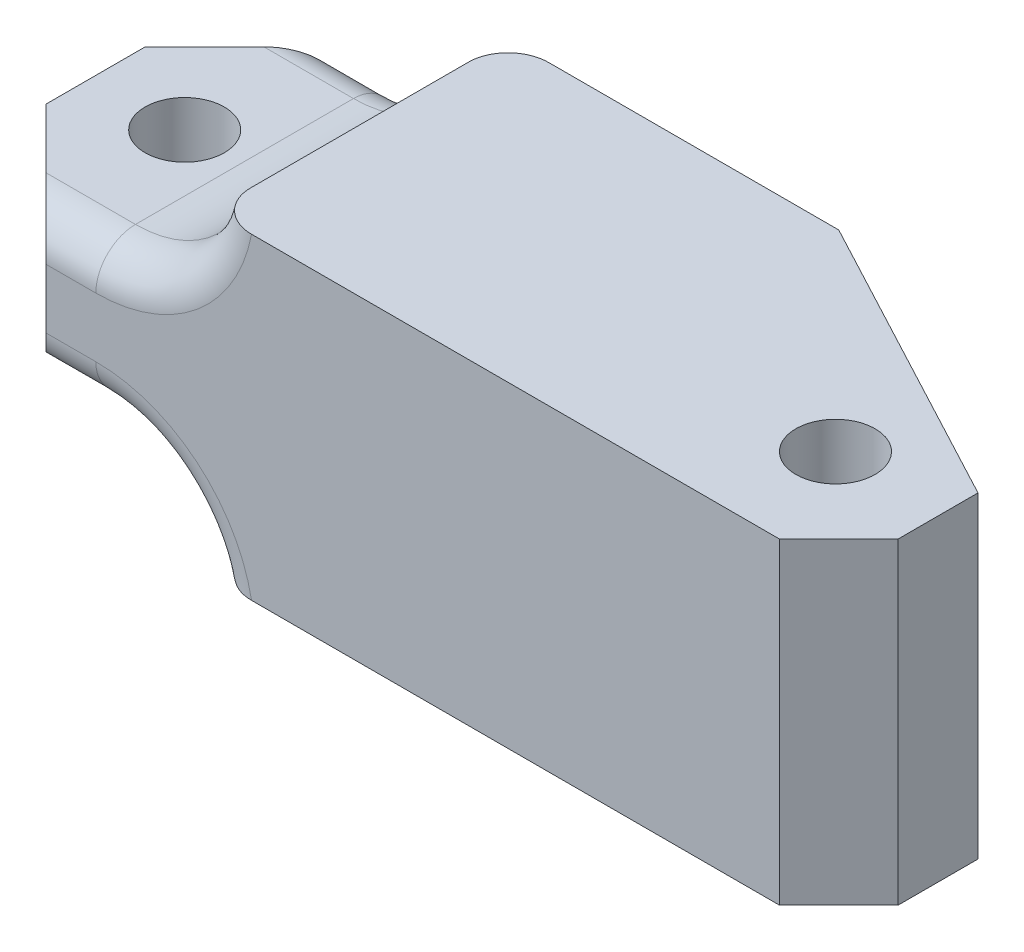
ISO-10303-21;
HEADER;
FILE_DESCRIPTION(('STEP AP214'),'2;1');
FILE_NAME('part.step','',(''),(''),'','','');
FILE_SCHEMA(('AUTOMOTIVE_DESIGN { 1 0 10303 214 1 1 1 1 }'));
ENDSEC;
DATA;
#1=APPLICATION_CONTEXT('core data for automotive mechanical design processes');
#2=APPLICATION_PROTOCOL_DEFINITION('international standard','automotive_design',2000,#1);
#3=PRODUCT_CONTEXT('',#1,'mechanical');
#4=PRODUCT('Part','Part','',(#3));
#5=PRODUCT_RELATED_PRODUCT_CATEGORY('part','',(#4));
#6=PRODUCT_DEFINITION_FORMATION('','',#4);
#7=PRODUCT_DEFINITION_CONTEXT('part definition',#1,'design');
#8=PRODUCT_DEFINITION('design','',#6,#7);
#9=PRODUCT_DEFINITION_SHAPE('','',#8);
#10=(LENGTH_UNIT() NAMED_UNIT(*) SI_UNIT(.MILLI.,.METRE.));
#11=(NAMED_UNIT(*) PLANE_ANGLE_UNIT() SI_UNIT($,.RADIAN.));
#12=(NAMED_UNIT(*) SI_UNIT($,.STERADIAN.) SOLID_ANGLE_UNIT());
#13=UNCERTAINTY_MEASURE_WITH_UNIT(LENGTH_MEASURE(1.E-05),#10,'distance_accuracy_value','');
#14=(GEOMETRIC_REPRESENTATION_CONTEXT(3) GLOBAL_UNCERTAINTY_ASSIGNED_CONTEXT((#13)) GLOBAL_UNIT_ASSIGNED_CONTEXT((#10,
#11,#12)) REPRESENTATION_CONTEXT('',''));
#15=CARTESIAN_POINT('',(0.,0.,0.));
#16=DIRECTION('',(0.,0.,1.));
#17=DIRECTION('',(1.,0.,0.));
#18=AXIS2_PLACEMENT_3D('',#15,#16,#17);
#19=CARTESIAN_POINT('',(22.5,8.,15.));
#20=DIRECTION('',(-1.,0.,0.));
#21=DIRECTION('',(0.,0.,1.));
#22=AXIS2_PLACEMENT_3D('',#19,#20,#21);
#23=PLANE('',#22);
#24=DIRECTION('',(0.,0.,-1.));
#25=VECTOR('',#24,1.);
#26=CARTESIAN_POINT('',(22.5,-8.,15.));
#27=LINE('',#26,#25);
#28=CARTESIAN_POINT('',(22.5,-8.,12.));
#29=VERTEX_POINT('',#28);
#30=CARTESIAN_POINT('',(22.5,-8.,7.9756414749222));
#31=VERTEX_POINT('',#30);
#32=EDGE_CURVE('E212',#29,#31,#27,.T.);
#33=ORIENTED_EDGE('',*,*,#32,.T.);
#34=DIRECTION('',(0.,1.,0.));
#35=VECTOR('',#34,1.);
#36=CARTESIAN_POINT('',(22.5,8.,7.9756414749222));
#37=LINE('',#36,#35);
#38=CARTESIAN_POINT('',(22.5,8.,7.9756414749222));
#39=VERTEX_POINT('',#38);
#40=EDGE_CURVE('E242',#31,#39,#37,.T.);
#41=ORIENTED_EDGE('',*,*,#40,.T.);
#42=DIRECTION('',(0.,0.,-1.));
#43=VECTOR('',#42,1.);
#44=CARTESIAN_POINT('',(22.5,8.,15.));
#45=LINE('',#44,#43);
#46=CARTESIAN_POINT('',(22.5,8.,12.));
#47=VERTEX_POINT('',#46);
#48=EDGE_CURVE('E217',#47,#39,#45,.T.);
#49=ORIENTED_EDGE('',*,*,#48,.F.);
#50=DIRECTION('',(0.,-1.,0.));
#51=VECTOR('',#50,1.);
#52=CARTESIAN_POINT('',(22.5,-8.,12.));
#53=LINE('',#52,#51);
#54=EDGE_CURVE('E237',#47,#29,#53,.T.);
#55=ORIENTED_EDGE('',*,*,#54,.T.);
#56=EDGE_LOOP('',(#33,#41,#49,#55));
#57=FACE_BOUND('',#56,.T.);
#58=ADVANCED_FACE('F33',(#57),#23,.F.);
#59=CARTESIAN_POINT('',(-22.5,8.,15.));
#60=DIRECTION('',(0.,-1.,0.));
#61=DIRECTION('',(0.,0.,-1.));
#62=AXIS2_PLACEMENT_3D('',#59,#60,#61);
#63=PLANE('',#62);
#64=CARTESIAN_POINT('',(17.1009286197695,8.,9.76804892721935));
#65=DIRECTION('',(0.,1.,0.));
#66=DIRECTION('',(0.,0.,1.));
#67=AXIS2_PLACEMENT_3D('',#64,#65,#66);
#68=CIRCLE('',#67,2.);
#69=CARTESIAN_POINT('',(17.1009286197695,8.,11.7680489272194));
#70=VERTEX_POINT('',#69);
#71=EDGE_CURVE('E348',#70,#70,#68,.T.);
#72=ORIENTED_EDGE('',*,*,#71,.F.);
#73=EDGE_LOOP('',(#72));
#74=FACE_BOUND('',#73,.T.);
#75=DIRECTION('',(-1.,0.,0.));
#76=VECTOR('',#75,1.);
#77=CARTESIAN_POINT('',(-22.5,8.,0.));
#78=LINE('',#77,#76);
#79=CARTESIAN_POINT('',(7.4999999999999,8.,0.));
#80=VERTEX_POINT('',#79);
#81=CARTESIAN_POINT('',(-7.12790382881395,8.,0.));
#82=VERTEX_POINT('',#81);
#83=EDGE_CURVE('E205',#80,#82,#78,.T.);
#84=ORIENTED_EDGE('',*,*,#83,.T.);
#85=CARTESIAN_POINT('',(-7.12790382881394,8.,0.));
#86=CARTESIAN_POINT('',(-7.18636362203939,8.,7.92871473694165E-07));
#87=CARTESIAN_POINT('',(-7.24479469438913,8.,0.0024744979902373));
#88=CARTESIAN_POINT('',(-7.36123743242487,8.,0.0123341991767193));
#89=CARTESIAN_POINT('',(-7.41924912294776,8.,0.0197199018936573));
#90=CARTESIAN_POINT('',(-7.59196425589466,8.,0.0491681366579513));
#91=CARTESIAN_POINT('',(-7.70551049848256,8.,0.0785219995628833));
#92=CARTESIAN_POINT('',(-7.92606516722449,8.,0.155852297749389));
#93=CARTESIAN_POINT('',(-8.03307078202384,8.,0.203836676726306));
#94=CARTESIAN_POINT('',(-8.23747805711283,8.,0.317135240666845));
#95=CARTESIAN_POINT('',(-8.33488149494602,8.,0.382446209858788));
#96=CARTESIAN_POINT('',(-8.51689017141972,8.,0.528425452384611));
#97=CARTESIAN_POINT('',(-8.60153608677708,8.,0.60904298010569));
#98=CARTESIAN_POINT('',(-8.75577715616483,8.,0.783627301712047));
#99=CARTESIAN_POINT('',(-8.82537040073209,8.,0.877595786692389));
#100=CARTESIAN_POINT('',(-8.94591967014968,8.,1.07421792400443));
#101=CARTESIAN_POINT('',(-8.99722079797362,8.,1.17666013182227));
#102=CARTESIAN_POINT('',(-9.08127090608603,8.,1.38884285893179));
#103=CARTESIAN_POINT('',(-9.11403919822943,8.,1.49857564740459));
#104=CARTESIAN_POINT('',(-9.1501083568946,8.,1.67436737085577));
#105=CARTESIAN_POINT('',(-9.16001502911339,8.,1.73913849071646));
#106=CARTESIAN_POINT('',(-9.17323221064496,8.,1.86926206013589));
#107=CARTESIAN_POINT('',(-9.17655155495039,8.,1.93461361280964));
#108=CARTESIAN_POINT('',(-9.17654563225368,8.,2.));
#109=B_SPLINE_CURVE_WITH_KNOTS('',3,(#85,#86,#87,#88,#89,#90,#91,#92,#93,#94,#95,#96,#97,#98,
#99,#100,#101,#102,#103,#104,#105,#106,#107,#108),.UNSPECIFIED.,.F.,.F.,(4,2,2,2,2,2,2,2,2,2,2,
4),(0.,0.175270448459846,0.35053043048412,0.700568383492885,1.05075575017601,1.40087816837649,
1.74985948247878,2.09888503966963,2.44092577311265,2.78260942849414,2.97887994756075,
3.17488704818072),.UNSPECIFIED.);
#110=CARTESIAN_POINT('',(-9.17654563225367,8.,2.));
#111=VERTEX_POINT('',#110);
#112=EDGE_CURVE('E57',#82,#111,#109,.T.);
#113=ORIENTED_EDGE('',*,*,#112,.T.);
#114=DIRECTION('',(0.,0.,1.));
#115=VECTOR('',#114,1.);
#116=CARTESIAN_POINT('',(-9.17654563225367,8.,15.));
#117=LINE('',#116,#115);
#118=CARTESIAN_POINT('',(-9.17654563225367,8.,13.));
#119=VERTEX_POINT('',#118);
#120=EDGE_CURVE('E197',#111,#119,#117,.T.);
#121=ORIENTED_EDGE('',*,*,#120,.T.);
#122=CARTESIAN_POINT('',(-9.17654563225367,8.,13.));
#123=CARTESIAN_POINT('',(-9.17654653900244,8.,13.0550961276605));
#124=CARTESIAN_POINT('',(-9.17419271591753,8.,13.110165245804));
#125=CARTESIAN_POINT('',(-9.1648108526436,8.,13.2198966870126));
#126=CARTESIAN_POINT('',(-9.15778342369205,8.,13.2745590623285));
#127=CARTESIAN_POINT('',(-9.12979242107461,8.,13.4371396185582));
#128=CARTESIAN_POINT('',(-9.10191969876249,8.,13.5439482504727));
#129=CARTESIAN_POINT('',(-9.02870784186527,8.,13.7513346998485));
#130=CARTESIAN_POINT('',(-8.98336736081586,8.,13.8519120362901));
#131=CARTESIAN_POINT('',(-8.87670610761419,8.,14.0442190252802));
#132=CARTESIAN_POINT('',(-8.81538300979467,8.,14.1359473875304));
#133=CARTESIAN_POINT('',(-8.67753417124749,8.,14.3095865204769));
#134=CARTESIAN_POINT('',(-8.60077911249146,8.,14.3913150154026));
#135=CARTESIAN_POINT('',(-8.43495676733046,8.,14.5411701571696));
#136=CARTESIAN_POINT('',(-8.3458862996629,8.,14.6092932783799));
#137=CARTESIAN_POINT('',(-8.15529064609105,8.,14.731943676759));
#138=CARTESIAN_POINT('',(-8.05348721904946,8.,14.7860383979449));
#139=CARTESIAN_POINT('',(-7.84236204649981,8.,14.8766654326623));
#140=CARTESIAN_POINT('',(-7.73304311036456,8.,14.9132042683942));
#141=CARTESIAN_POINT('',(-7.54076423510072,8.,14.9602302967286));
#142=CARTESIAN_POINT('',(-7.45885326235899,8.,14.975123766296));
#143=CARTESIAN_POINT('',(-7.29394046682053,8.,14.9950099141498));
#144=CARTESIAN_POINT('',(-7.21094009727084,8.,15.0000146530072));
#145=CARTESIAN_POINT('',(-7.12790382881395,8.,15.));
#146=B_SPLINE_CURVE_WITH_KNOTS('',3,(#122,#123,#124,#125,#126,#127,#128,#129,#130,#131,#132,
#133,#134,#135,#136,#137,#138,#139,#140,#141,#142,#143,#144,#145),.UNSPECIFIED.,.F.,.F.,(4,2,2,
2,2,2,2,2,2,2,2,4),(0.,0.165184817839259,0.330348036232131,0.659794968246631,0.989267300046264,
1.31878760091401,1.65362441608765,1.98854788699939,2.33281965405567,2.67696342135916,
2.92615825061574,3.1750489668682),.UNSPECIFIED.);
#147=CARTESIAN_POINT('',(-7.12790382881395,8.,15.));
#148=VERTEX_POINT('',#147);
#149=EDGE_CURVE('E365',#119,#148,#146,.T.);
#150=ORIENTED_EDGE('',*,*,#149,.T.);
#151=DIRECTION('',(-1.,0.,0.));
#152=VECTOR('',#151,1.);
#153=CARTESIAN_POINT('',(-22.5,8.,15.));
#154=LINE('',#153,#152);
#155=CARTESIAN_POINT('',(19.5,8.,15.));
#156=VERTEX_POINT('',#155);
#157=EDGE_CURVE('E206',#156,#148,#154,.T.);
#158=ORIENTED_EDGE('',*,*,#157,.F.);
#159=DIRECTION('',(0.707106781186547,0.,-0.707106781186548));
#160=VECTOR('',#159,1.);
#161=CARTESIAN_POINT('',(19.5,8.,15.));
#162=LINE('',#161,#160);
#163=EDGE_CURVE('E235',#156,#47,#162,.T.);
#164=ORIENTED_EDGE('',*,*,#163,.T.);
#165=ORIENTED_EDGE('',*,*,#48,.T.);
#166=DIRECTION('',(0.882947592858928,0.,0.469471562785889));
#167=VECTOR('',#166,1.);
#168=CARTESIAN_POINT('',(22.5,8.,7.9756414749222));
#169=LINE('',#168,#167);
#170=EDGE_CURVE('E245',#39,#80,#169,.F.);
#171=ORIENTED_EDGE('',*,*,#170,.T.);
#172=EDGE_LOOP('',(#84,#113,#121,#150,#158,#164,#165,#171));
#173=FACE_BOUND('',#172,.T.);
#174=ADVANCED_FACE('F400',(#74,#173),#63,.F.);
#175=CARTESIAN_POINT('',(-22.5,8.,15.));
#176=DIRECTION('',(1.,0.,0.));
#177=DIRECTION('',(0.,0.,-1.));
#178=AXIS2_PLACEMENT_3D('',#175,#176,#177);
#179=PLANE('',#178);
#180=DIRECTION('',(0.,0.,-1.));
#181=VECTOR('',#180,1.);
#182=CARTESIAN_POINT('',(-22.5,3.5,15.));
#183=LINE('',#182,#181);
#184=CARTESIAN_POINT('',(-22.5,3.5,9.99999999999998));
#185=VERTEX_POINT('',#184);
#186=CARTESIAN_POINT('',(-22.5,3.5,5.00000000000001));
#187=VERTEX_POINT('',#186);
#188=EDGE_CURVE('E188',#185,#187,#183,.T.);
#189=ORIENTED_EDGE('',*,*,#188,.T.);
#190=DIRECTION('',(0.,-1.,0.));
#191=VECTOR('',#190,1.);
#192=CARTESIAN_POINT('',(-22.5,8.,5.00000000000001));
#193=LINE('',#192,#191);
#194=CARTESIAN_POINT('',(-22.5,-3.5,5.00000000000001));
#195=VERTEX_POINT('',#194);
#196=EDGE_CURVE('E172',#187,#195,#193,.T.);
#197=ORIENTED_EDGE('',*,*,#196,.T.);
#198=DIRECTION('',(0.,0.,1.));
#199=VECTOR('',#198,1.);
#200=CARTESIAN_POINT('',(-22.5,-3.5,15.));
#201=LINE('',#200,#199);
#202=CARTESIAN_POINT('',(-22.5,-3.5,9.99999999999998));
#203=VERTEX_POINT('',#202);
#204=EDGE_CURVE('E185',#195,#203,#201,.T.);
#205=ORIENTED_EDGE('',*,*,#204,.T.);
#206=DIRECTION('',(0.,1.,0.));
#207=VECTOR('',#206,1.);
#208=CARTESIAN_POINT('',(-22.5,3.5,9.99999999999998));
#209=LINE('',#208,#207);
#210=EDGE_CURVE('E189',#203,#185,#209,.T.);
#211=ORIENTED_EDGE('',*,*,#210,.T.);
#212=EDGE_LOOP('',(#189,#197,#205,#211));
#213=FACE_BOUND('',#212,.T.);
#214=ADVANCED_FACE('F184',(#213),#179,.F.);
#215=CARTESIAN_POINT('',(-22.5,-8.,15.));
#216=DIRECTION('',(0.,1.,0.));
#217=DIRECTION('',(0.,0.,1.));
#218=AXIS2_PLACEMENT_3D('',#215,#216,#217);
#219=PLANE('',#218);
#220=CARTESIAN_POINT('',(17.1009286197695,-8.,9.76804892721935));
#221=DIRECTION('',(0.,1.,0.));
#222=DIRECTION('',(0.,0.,1.));
#223=AXIS2_PLACEMENT_3D('',#220,#221,#222);
#224=CIRCLE('',#223,2.);
#225=CARTESIAN_POINT('',(17.1009286197695,-8.,11.7680489272194));
#226=VERTEX_POINT('',#225);
#227=EDGE_CURVE('E619',#226,#226,#224,.T.);
#228=ORIENTED_EDGE('',*,*,#227,.T.);
#229=EDGE_LOOP('',(#228));
#230=FACE_BOUND('',#229,.T.);
#231=DIRECTION('',(1.,0.,0.));
#232=VECTOR('',#231,1.);
#233=CARTESIAN_POINT('',(-22.5,-8.,15.));
#234=LINE('',#233,#232);
#235=CARTESIAN_POINT('',(-7.12790382881395,-8.,15.));
#236=VERTEX_POINT('',#235);
#237=CARTESIAN_POINT('',(19.5,-8.,15.));
#238=VERTEX_POINT('',#237);
#239=EDGE_CURVE('E209',#236,#238,#234,.T.);
#240=ORIENTED_EDGE('',*,*,#239,.F.);
#241=CARTESIAN_POINT('',(-7.12790382881394,-8.,15.));
#242=CARTESIAN_POINT('',(-7.18444486523103,-8.,15.0000045723708));
#243=CARTESIAN_POINT('',(-7.24098439206954,-8.,14.9976866476204));
#244=CARTESIAN_POINT('',(-7.353316602756,-8.,14.9884814426028));
#245=CARTESIAN_POINT('',(-7.40911175281566,-8.,14.981624257281));
#246=CARTESIAN_POINT('',(-7.51996202158665,-8.,14.9634150828803));
#247=CARTESIAN_POINT('',(-7.57501715940314,-8.,14.9520632100737));
#248=CARTESIAN_POINT('',(-7.68439041831797,-8.,14.9248583350745));
#249=CARTESIAN_POINT('',(-7.73870126576185,-8.,14.9089760868029));
#250=CARTESIAN_POINT('',(-7.79227336659572,-8.,14.8909012807634));
#251=B_SPLINE_CURVE_WITH_KNOTS('',3,(#241,#242,#243,#244,#245,#246,#247,#248,#249,#250),
.UNSPECIFIED.,.F.,.F.,(4,2,2,2,4),(0.,0.16957333369921,0.3380335207423,0.506489350202199,
0.676058270090158),.UNSPECIFIED.);
#252=CARTESIAN_POINT('',(-7.79227336659572,-8.,14.8909012807634));
#253=VERTEX_POINT('',#252);
#254=EDGE_CURVE('E314',#236,#253,#251,.T.);
#255=ORIENTED_EDGE('',*,*,#254,.T.);
#256=DIRECTION('',(0.,0.,1.));
#257=VECTOR('',#256,1.);
#258=CARTESIAN_POINT('',(-7.79227336659572,-8.,15.));
#259=LINE('',#258,#257);
#260=CARTESIAN_POINT('',(-7.79227336659572,-8.,0.109098719236631));
#261=VERTEX_POINT('',#260);
#262=EDGE_CURVE('E297',#253,#261,#259,.F.);
#263=ORIENTED_EDGE('',*,*,#262,.T.);
#264=CARTESIAN_POINT('',(-7.79227336659572,-8.,0.109098719236631));
#265=CARTESIAN_POINT('',(-7.73870126576185,-8.,0.0910239131970945));
#266=CARTESIAN_POINT('',(-7.68439041831797,-8.,0.0751416649254693));
#267=CARTESIAN_POINT('',(-7.57501715940314,-8.,0.0479367899263236));
#268=CARTESIAN_POINT('',(-7.51996202158665,-8.,0.0365849171196939));
#269=CARTESIAN_POINT('',(-7.40911175281567,-8.,0.018375742718966));
#270=CARTESIAN_POINT('',(-7.353316602756,-8.,0.0115185573971727));
#271=CARTESIAN_POINT('',(-7.24098439206954,-8.,0.00231335237964249));
#272=CARTESIAN_POINT('',(-7.18444486523103,-8.,-4.57237076912174E-06));
#273=CARTESIAN_POINT('',(-7.12790382881395,-8.,0.));
#274=B_SPLINE_CURVE_WITH_KNOTS('',3,(#264,#265,#266,#267,#268,#269,#270,#271,#272,#273),
.UNSPECIFIED.,.F.,.F.,(4,2,2,2,4),(0.,0.169568919887958,0.338024749347856,0.506484936390948,
0.676058270090155),.UNSPECIFIED.);
#275=CARTESIAN_POINT('',(-7.12790382881395,-8.,0.));
#276=VERTEX_POINT('',#275);
#277=EDGE_CURVE('E290',#261,#276,#274,.T.);
#278=ORIENTED_EDGE('',*,*,#277,.T.);
#279=DIRECTION('',(1.,0.,0.));
#280=VECTOR('',#279,1.);
#281=CARTESIAN_POINT('',(-22.5,-8.,0.));
#282=LINE('',#281,#280);
#283=CARTESIAN_POINT('',(7.49999999999979,-8.,0.));
#284=VERTEX_POINT('',#283);
#285=EDGE_CURVE('E210',#276,#284,#282,.T.);
#286=ORIENTED_EDGE('',*,*,#285,.T.);
#287=DIRECTION('',(-0.882947592858928,0.,-0.469471562785889));
#288=VECTOR('',#287,1.);
#289=CARTESIAN_POINT('',(22.5,-8.,7.9756414749222));
#290=LINE('',#289,#288);
#291=EDGE_CURVE('E250',#284,#31,#290,.F.);
#292=ORIENTED_EDGE('',*,*,#291,.T.);
#293=ORIENTED_EDGE('',*,*,#32,.F.);
#294=DIRECTION('',(-0.707106781186547,0.,0.707106781186548));
#295=VECTOR('',#294,1.);
#296=CARTESIAN_POINT('',(19.5,-8.,15.));
#297=LINE('',#296,#295);
#298=EDGE_CURVE('E239',#29,#238,#297,.T.);
#299=ORIENTED_EDGE('',*,*,#298,.T.);
#300=EDGE_LOOP('',(#240,#255,#263,#278,#286,#292,#293,#299));
#301=FACE_BOUND('',#300,.T.);
#302=ADVANCED_FACE('F303',(#230,#301),#219,.F.);
#303=CARTESIAN_POINT('',(22.5,-8.,15.));
#304=DIRECTION('',(0.,0.,1.));
#305=DIRECTION('',(1.,0.,0.));
#306=AXIS2_PLACEMENT_3D('',#303,#304,#305);
#307=PLANE('',#306);
#308=DIRECTION('',(0.,-1.,0.));
#309=VECTOR('',#308,1.);
#310=CARTESIAN_POINT('',(-17.5,-3.5,15.));
#311=LINE('',#310,#309);
#312=CARTESIAN_POINT('',(-17.5,1.5,15.));
#313=VERTEX_POINT('',#312);
#314=CARTESIAN_POINT('',(-17.5,-1.5,15.));
#315=VERTEX_POINT('',#314);
#316=EDGE_CURVE('E229',#313,#315,#311,.T.);
#317=ORIENTED_EDGE('',*,*,#316,.T.);
#318=DIRECTION('',(-1.,0.,0.));
#319=VECTOR('',#318,1.);
#320=CARTESIAN_POINT('',(-14.9860206515648,-1.5,15.));
#321=LINE('',#320,#319);
#322=CARTESIAN_POINT('',(-14.9860206515648,-1.5,15.));
#323=VERTEX_POINT('',#322);
#324=EDGE_CURVE('E271',#315,#323,#321,.F.);
#325=ORIENTED_EDGE('',*,*,#324,.T.);
#326=CARTESIAN_POINT('',(-14.9860206515648,-9.5,15.));
#327=DIRECTION('',(0.,0.,1.));
#328=DIRECTION('',(1.,0.,0.));
#329=AXIS2_PLACEMENT_3D('',#326,#327,#328);
#330=CIRCLE('',#329,8.);
#331=EDGE_CURVE('E269',#323,#236,#330,.F.);
#332=ORIENTED_EDGE('',*,*,#331,.T.);
#333=ORIENTED_EDGE('',*,*,#239,.T.);
#334=DIRECTION('',(0.,1.,0.));
#335=VECTOR('',#334,1.);
#336=CARTESIAN_POINT('',(19.5,8.,15.));
#337=LINE('',#336,#335);
#338=EDGE_CURVE('E232',#238,#156,#337,.T.);
#339=ORIENTED_EDGE('',*,*,#338,.T.);
#340=ORIENTED_EDGE('',*,*,#157,.T.);
#341=CARTESIAN_POINT('',(-14.9860206515648,9.5,15.));
#342=DIRECTION('',(0.,0.,1.));
#343=DIRECTION('',(1.,0.,0.));
#344=AXIS2_PLACEMENT_3D('',#341,#342,#343);
#345=CIRCLE('',#344,8.);
#346=CARTESIAN_POINT('',(-14.9860206515648,1.5,15.));
#347=VERTEX_POINT('',#346);
#348=EDGE_CURVE('E265',#148,#347,#345,.F.);
#349=ORIENTED_EDGE('',*,*,#348,.T.);
#350=DIRECTION('',(1.,0.,0.));
#351=VECTOR('',#350,1.);
#352=CARTESIAN_POINT('',(-17.5,1.5,15.));
#353=LINE('',#352,#351);
#354=EDGE_CURVE('E267',#347,#313,#353,.F.);
#355=ORIENTED_EDGE('',*,*,#354,.T.);
#356=EDGE_LOOP('',(#317,#325,#332,#333,#339,#340,#349,#355));
#357=FACE_BOUND('',#356,.T.);
#358=ADVANCED_FACE('F308',(#357),#307,.T.);
#359=CARTESIAN_POINT('',(22.5,-8.,0.));
#360=DIRECTION('',(0.,0.,1.));
#361=DIRECTION('',(1.,0.,0.));
#362=AXIS2_PLACEMENT_3D('',#359,#360,#361);
#363=PLANE('',#362);
#364=CARTESIAN_POINT('',(-14.9860206515648,-9.5,0.));
#365=DIRECTION('',(0.,0.,1.));
#366=DIRECTION('',(1.,0.,0.));
#367=AXIS2_PLACEMENT_3D('',#364,#365,#366);
#368=CIRCLE('',#367,8.);
#369=CARTESIAN_POINT('',(-14.9860206515648,-1.5,0.));
#370=VERTEX_POINT('',#369);
#371=EDGE_CURVE('E278',#276,#370,#368,.T.);
#372=ORIENTED_EDGE('',*,*,#371,.T.);
#373=DIRECTION('',(-1.,0.,0.));
#374=VECTOR('',#373,1.);
#375=CARTESIAN_POINT('',(22.5,-1.50000000000001,0.));
#376=LINE('',#375,#374);
#377=CARTESIAN_POINT('',(-17.5,-1.5,0.));
#378=VERTEX_POINT('',#377);
#379=EDGE_CURVE('E280',#370,#378,#376,.T.);
#380=ORIENTED_EDGE('',*,*,#379,.T.);
#381=DIRECTION('',(0.,1.,0.));
#382=VECTOR('',#381,1.);
#383=CARTESIAN_POINT('',(-17.5,-8.,0.));
#384=LINE('',#383,#382);
#385=CARTESIAN_POINT('',(-17.5,1.5,0.));
#386=VERTEX_POINT('',#385);
#387=EDGE_CURVE('E178',#378,#386,#384,.T.);
#388=ORIENTED_EDGE('',*,*,#387,.T.);
#389=DIRECTION('',(1.,0.,0.));
#390=VECTOR('',#389,1.);
#391=CARTESIAN_POINT('',(22.5,1.5,0.));
#392=LINE('',#391,#390);
#393=CARTESIAN_POINT('',(-14.9860206515648,1.5,0.));
#394=VERTEX_POINT('',#393);
#395=EDGE_CURVE('E275',#386,#394,#392,.T.);
#396=ORIENTED_EDGE('',*,*,#395,.T.);
#397=CARTESIAN_POINT('',(-14.9860206515648,9.5,0.));
#398=DIRECTION('',(0.,0.,1.));
#399=DIRECTION('',(1.,0.,0.));
#400=AXIS2_PLACEMENT_3D('',#397,#398,#399);
#401=CIRCLE('',#400,8.);
#402=EDGE_CURVE('E273',#394,#82,#401,.T.);
#403=ORIENTED_EDGE('',*,*,#402,.T.);
#404=ORIENTED_EDGE('',*,*,#83,.F.);
#405=DIRECTION('',(0.,-1.,0.));
#406=VECTOR('',#405,1.);
#407=CARTESIAN_POINT('',(7.4999999999999,-8.,0.));
#408=LINE('',#407,#406);
#409=EDGE_CURVE('E247',#80,#284,#408,.T.);
#410=ORIENTED_EDGE('',*,*,#409,.T.);
#411=ORIENTED_EDGE('',*,*,#285,.F.);
#412=EDGE_LOOP('',(#372,#380,#388,#396,#403,#404,#410,#411));
#413=FACE_BOUND('',#412,.T.);
#414=ADVANCED_FACE('F310',(#413),#363,.F.);
#415=CARTESIAN_POINT('',(-25.6046163714501,3.5,0.));
#416=DIRECTION('',(0.,-1.,0.));
#417=DIRECTION('',(1.,0.,0.));
#418=AXIS2_PLACEMENT_3D('',#415,#416,#417);
#419=PLANE('',#418);
#420=CARTESIAN_POINT('',(-17.8755530243002,3.5,7.62617046792852));
#421=DIRECTION('',(0.,-1.,0.));
#422=DIRECTION('',(1.,0.,0.));
#423=AXIS2_PLACEMENT_3D('',#420,#421,#422);
#424=CIRCLE('',#423,2.);
#425=CARTESIAN_POINT('',(-15.8755530243002,3.5,7.62617046792852));
#426=VERTEX_POINT('',#425);
#427=EDGE_CURVE('E195',#426,#426,#424,.T.);
#428=ORIENTED_EDGE('',*,*,#427,.T.);
#429=EDGE_LOOP('',(#428));
#430=FACE_BOUND('',#429,.T.);
#431=DIRECTION('',(0.,0.,-1.));
#432=VECTOR('',#431,1.);
#433=CARTESIAN_POINT('',(-14.9860206515648,3.5,0.));
#434=LINE('',#433,#432);
#435=CARTESIAN_POINT('',(-14.9860206515648,3.5,13.));
#436=VERTEX_POINT('',#435);
#437=CARTESIAN_POINT('',(-14.9860206515648,3.5,2.));
#438=VERTEX_POINT('',#437);
#439=EDGE_CURVE('E254',#436,#438,#434,.T.);
#440=ORIENTED_EDGE('',*,*,#439,.T.);
#441=DIRECTION('',(1.,0.,0.));
#442=VECTOR('',#441,1.);
#443=CARTESIAN_POINT('',(-25.6046163714501,3.5,2.));
#444=LINE('',#443,#442);
#445=CARTESIAN_POINT('',(-19.5,3.5,2.));
#446=VERTEX_POINT('',#445);
#447=EDGE_CURVE('E288',#438,#446,#444,.F.);
#448=ORIENTED_EDGE('',*,*,#447,.T.);
#449=DIRECTION('',(0.707106781186549,0.,-0.707106781186547));
#450=VECTOR('',#449,1.);
#451=CARTESIAN_POINT('',(-22.5,3.5,5.00000000000001));
#452=LINE('',#451,#450);
#453=EDGE_CURVE('E227',#446,#187,#452,.F.);
#454=ORIENTED_EDGE('',*,*,#453,.T.);
#455=ORIENTED_EDGE('',*,*,#188,.F.);
#456=DIRECTION('',(0.707106781186547,0.,0.707106781186549));
#457=VECTOR('',#456,1.);
#458=CARTESIAN_POINT('',(-17.5,3.5,15.));
#459=LINE('',#458,#457);
#460=CARTESIAN_POINT('',(-19.5,3.5,13.));
#461=VERTEX_POINT('',#460);
#462=EDGE_CURVE('E224',#185,#461,#459,.T.);
#463=ORIENTED_EDGE('',*,*,#462,.T.);
#464=DIRECTION('',(1.,0.,0.));
#465=VECTOR('',#464,1.);
#466=CARTESIAN_POINT('',(-14.9860206515648,3.5,13.));
#467=LINE('',#466,#465);
#468=EDGE_CURVE('E285',#461,#436,#467,.T.);
#469=ORIENTED_EDGE('',*,*,#468,.T.);
#470=EDGE_LOOP('',(#440,#448,#454,#455,#463,#469));
#471=FACE_BOUND('',#470,.T.);
#472=ADVANCED_FACE('F368',(#430,#471),#419,.F.);
#473=CARTESIAN_POINT('',(-25.6046163714501,-3.5,0.));
#474=DIRECTION('',(0.,1.,0.));
#475=DIRECTION('',(-1.,0.,0.));
#476=AXIS2_PLACEMENT_3D('',#473,#474,#475);
#477=PLANE('',#476);
#478=CARTESIAN_POINT('',(-17.8755530243002,-3.5,7.62617046792852));
#479=DIRECTION('',(0.,-1.,0.));
#480=DIRECTION('',(1.,0.,0.));
#481=AXIS2_PLACEMENT_3D('',#478,#479,#480);
#482=CIRCLE('',#481,2.);
#483=CARTESIAN_POINT('',(-15.8755530243002,-3.5,7.62617046792852));
#484=VERTEX_POINT('',#483);
#485=EDGE_CURVE('E200',#484,#484,#482,.T.);
#486=ORIENTED_EDGE('',*,*,#485,.F.);
#487=EDGE_LOOP('',(#486));
#488=FACE_BOUND('',#487,.T.);
#489=DIRECTION('',(0.,0.,1.));
#490=VECTOR('',#489,1.);
#491=CARTESIAN_POINT('',(-14.9860206515648,-3.5,0.));
#492=LINE('',#491,#490);
#493=CARTESIAN_POINT('',(-14.9860206515648,-3.5,2.));
#494=VERTEX_POINT('',#493);
#495=CARTESIAN_POINT('',(-14.9860206515648,-3.5,13.));
#496=VERTEX_POINT('',#495);
#497=EDGE_CURVE('E252',#494,#496,#492,.T.);
#498=ORIENTED_EDGE('',*,*,#497,.T.);
#499=DIRECTION('',(-1.,0.,0.));
#500=VECTOR('',#499,1.);
#501=CARTESIAN_POINT('',(-17.5,-3.5,13.));
#502=LINE('',#501,#500);
#503=CARTESIAN_POINT('',(-19.5,-3.5,13.));
#504=VERTEX_POINT('',#503);
#505=EDGE_CURVE('E259',#496,#504,#502,.T.);
#506=ORIENTED_EDGE('',*,*,#505,.T.);
#507=DIRECTION('',(-0.707106781186547,0.,-0.707106781186549));
#508=VECTOR('',#507,1.);
#509=CARTESIAN_POINT('',(-17.5,-3.5,15.));
#510=LINE('',#509,#508);
#511=EDGE_CURVE('E179',#504,#203,#510,.T.);
#512=ORIENTED_EDGE('',*,*,#511,.T.);
#513=ORIENTED_EDGE('',*,*,#204,.F.);
#514=DIRECTION('',(-0.707106781186549,0.,0.707106781186547));
#515=VECTOR('',#514,1.);
#516=CARTESIAN_POINT('',(-22.5,-3.5,5.00000000000001));
#517=LINE('',#516,#515);
#518=CARTESIAN_POINT('',(-19.5,-3.5,2.));
#519=VERTEX_POINT('',#518);
#520=EDGE_CURVE('E167',#195,#519,#517,.F.);
#521=ORIENTED_EDGE('',*,*,#520,.T.);
#522=DIRECTION('',(-1.,0.,0.));
#523=VECTOR('',#522,1.);
#524=CARTESIAN_POINT('',(-25.6046163714501,-3.5,2.));
#525=LINE('',#524,#523);
#526=EDGE_CURVE('E257',#519,#494,#525,.F.);
#527=ORIENTED_EDGE('',*,*,#526,.T.);
#528=EDGE_LOOP('',(#498,#506,#512,#513,#521,#527));
#529=FACE_BOUND('',#528,.T.);
#530=ADVANCED_FACE('F192',(#488,#529),#477,.F.);
#531=CARTESIAN_POINT('',(-22.5,8.,5.00000000000001));
#532=DIRECTION('',(0.707106781186547,0.,0.707106781186549));
#533=DIRECTION('',(0.707106781186549,0.,-0.707106781186547));
#534=AXIS2_PLACEMENT_3D('',#531,#532,#533);
#535=PLANE('',#534);
#536=ORIENTED_EDGE('',*,*,#387,.F.);
#537=CARTESIAN_POINT('',(-19.5,-1.5,2.));
#538=DIRECTION('',(0.707106781186547,0.,0.707106781186549));
#539=DIRECTION('',(-0.707106781186549,0.,0.707106781186547));
#540=AXIS2_PLACEMENT_3D('',#537,#538,#539);
#541=ELLIPSE('',#540,2.82842712474619,2.);
#542=EDGE_CURVE('E174',#378,#519,#541,.F.);
#543=ORIENTED_EDGE('',*,*,#542,.T.);
#544=ORIENTED_EDGE('',*,*,#520,.F.);
#545=ORIENTED_EDGE('',*,*,#196,.F.);
#546=ORIENTED_EDGE('',*,*,#453,.F.);
#547=CARTESIAN_POINT('',(-19.5,1.5,2.));
#548=DIRECTION('',(0.707106781186547,0.,0.707106781186549));
#549=DIRECTION('',(0.707106781186549,0.,-0.707106781186547));
#550=AXIS2_PLACEMENT_3D('',#547,#548,#549);
#551=ELLIPSE('',#550,2.82842712474619,2.);
#552=EDGE_CURVE('E282',#446,#386,#551,.F.);
#553=ORIENTED_EDGE('',*,*,#552,.T.);
#554=EDGE_LOOP('',(#536,#543,#544,#545,#546,#553));
#555=FACE_BOUND('',#554,.T.);
#556=ADVANCED_FACE('F170',(#555),#535,.F.);
#557=CARTESIAN_POINT('',(-17.5,-8.,15.));
#558=DIRECTION('',(-0.707106781186549,0.,0.707106781186547));
#559=DIRECTION('',(0.707106781186547,0.,0.707106781186549));
#560=AXIS2_PLACEMENT_3D('',#557,#558,#559);
#561=PLANE('',#560);
#562=ORIENTED_EDGE('',*,*,#511,.F.);
#563=CARTESIAN_POINT('',(-19.5,-1.5,13.));
#564=DIRECTION('',(-0.707106781186549,0.,0.707106781186547));
#565=DIRECTION('',(0.707106781186547,0.,0.707106781186549));
#566=AXIS2_PLACEMENT_3D('',#563,#564,#565);
#567=ELLIPSE('',#566,2.82842712474619,2.);
#568=EDGE_CURVE('E263',#504,#315,#567,.T.);
#569=ORIENTED_EDGE('',*,*,#568,.T.);
#570=ORIENTED_EDGE('',*,*,#316,.F.);
#571=CARTESIAN_POINT('',(-19.5,1.5,13.));
#572=DIRECTION('',(-0.707106781186549,0.,0.707106781186547));
#573=DIRECTION('',(-0.707106781186547,0.,-0.707106781186549));
#574=AXIS2_PLACEMENT_3D('',#571,#572,#573);
#575=ELLIPSE('',#574,2.82842712474619,2.);
#576=EDGE_CURVE('E261',#313,#461,#575,.T.);
#577=ORIENTED_EDGE('',*,*,#576,.T.);
#578=ORIENTED_EDGE('',*,*,#462,.F.);
#579=ORIENTED_EDGE('',*,*,#210,.F.);
#580=EDGE_LOOP('',(#562,#569,#570,#577,#578,#579));
#581=FACE_BOUND('',#580,.T.);
#582=ADVANCED_FACE('F379',(#581),#561,.T.);
#583=CARTESIAN_POINT('',(-17.8755530243002,8.00000000000001,7.62617046792852));
#584=DIRECTION('',(0.,-1.,0.));
#585=DIRECTION('',(1.,0.,0.));
#586=AXIS2_PLACEMENT_3D('',#583,#584,#585);
#587=CYLINDRICAL_SURFACE('',#586,2.);
#588=ORIENTED_EDGE('',*,*,#485,.T.);
#589=EDGE_LOOP('',(#588));
#590=FACE_BOUND('',#589,.T.);
#591=ORIENTED_EDGE('',*,*,#427,.F.);
#592=EDGE_LOOP('',(#591));
#593=FACE_BOUND('',#592,.T.);
#594=ADVANCED_FACE('F425',(#590,#593),#587,.F.);
#595=CARTESIAN_POINT('',(17.1009286197695,-8.,9.76804892721935));
#596=DIRECTION('',(0.,1.,0.));
#597=DIRECTION('',(0.,0.,1.));
#598=AXIS2_PLACEMENT_3D('',#595,#596,#597);
#599=CYLINDRICAL_SURFACE('',#598,2.);
#600=ORIENTED_EDGE('',*,*,#227,.F.);
#601=EDGE_LOOP('',(#600));
#602=FACE_BOUND('',#601,.T.);
#603=ORIENTED_EDGE('',*,*,#71,.T.);
#604=EDGE_LOOP('',(#603));
#605=FACE_BOUND('',#604,.T.);
#606=ADVANCED_FACE('F429',(#602,#605),#599,.F.);
#607=CARTESIAN_POINT('',(19.5,-8.,15.));
#608=DIRECTION('',(0.707106781186548,0.,0.707106781186547));
#609=DIRECTION('',(0.707106781186547,0.,-0.707106781186548));
#610=AXIS2_PLACEMENT_3D('',#607,#608,#609);
#611=PLANE('',#610);
#612=ORIENTED_EDGE('',*,*,#298,.F.);
#613=ORIENTED_EDGE('',*,*,#54,.F.);
#614=ORIENTED_EDGE('',*,*,#163,.F.);
#615=ORIENTED_EDGE('',*,*,#338,.F.);
#616=EDGE_LOOP('',(#612,#613,#614,#615));
#617=FACE_BOUND('',#616,.T.);
#618=ADVANCED_FACE('F398',(#617),#611,.T.);
#619=CARTESIAN_POINT('',(22.5,8.,7.9756414749222));
#620=DIRECTION('',(-0.469471562785889,0.,0.882947592858928));
#621=DIRECTION('',(0.882947592858928,0.,0.469471562785889));
#622=AXIS2_PLACEMENT_3D('',#619,#620,#621);
#623=PLANE('',#622);
#624=ORIENTED_EDGE('',*,*,#291,.F.);
#625=ORIENTED_EDGE('',*,*,#409,.F.);
#626=ORIENTED_EDGE('',*,*,#170,.F.);
#627=ORIENTED_EDGE('',*,*,#40,.F.);
#628=EDGE_LOOP('',(#624,#625,#626,#627));
#629=FACE_BOUND('',#628,.T.);
#630=ADVANCED_FACE('F428',(#629),#623,.F.);
#631=CARTESIAN_POINT('',(-14.9860206515648,-9.5,0.));
#632=DIRECTION('',(0.,0.,1.));
#633=DIRECTION('',(1.,0.,0.));
#634=AXIS2_PLACEMENT_3D('',#631,#632,#633);
#635=CYLINDRICAL_SURFACE('',#634,6.);
#636=DIRECTION('',(0.,0.,1.));
#637=VECTOR('',#636,1.);
#638=CARTESIAN_POINT('',(-9.59071018783799,-6.875,0.));
#639=LINE('',#638,#637);
#640=CARTESIAN_POINT('',(-9.59071018783799,-6.875,2.));
#641=VERTEX_POINT('',#640);
#642=CARTESIAN_POINT('',(-9.59071018783799,-6.875,13.));
#643=VERTEX_POINT('',#642);
#644=EDGE_CURVE('E404',#641,#643,#639,.T.);
#645=ORIENTED_EDGE('',*,*,#644,.T.);
#646=CARTESIAN_POINT('',(-14.9860206515648,-9.5,13.));
#647=DIRECTION('',(0.,0.,1.));
#648=DIRECTION('',(1.,0.,0.));
#649=AXIS2_PLACEMENT_3D('',#646,#647,#648);
#650=CIRCLE('',#649,6.);
#651=EDGE_CURVE('E389',#643,#496,#650,.T.);
#652=ORIENTED_EDGE('',*,*,#651,.T.);
#653=ORIENTED_EDGE('',*,*,#497,.F.);
#654=CARTESIAN_POINT('',(-14.9860206515648,-9.5,2.));
#655=DIRECTION('',(0.,0.,1.));
#656=DIRECTION('',(1.,0.,0.));
#657=AXIS2_PLACEMENT_3D('',#654,#655,#656);
#658=CIRCLE('',#657,6.);
#659=EDGE_CURVE('E319',#494,#641,#658,.F.);
#660=ORIENTED_EDGE('',*,*,#659,.T.);
#661=EDGE_LOOP('',(#645,#652,#653,#660));
#662=FACE_BOUND('',#661,.T.);
#663=ADVANCED_FACE('F432',(#662),#635,.F.);
#664=CARTESIAN_POINT('',(-14.9860206515648,9.5,0.));
#665=DIRECTION('',(0.,0.,-1.));
#666=DIRECTION('',(-1.,0.,0.));
#667=AXIS2_PLACEMENT_3D('',#664,#665,#666);
#668=CYLINDRICAL_SURFACE('',#667,6.);
#669=ORIENTED_EDGE('',*,*,#120,.F.);
#670=CARTESIAN_POINT('',(-14.9860206515648,9.5,2.));
#671=DIRECTION('',(0.,0.,1.));
#672=DIRECTION('',(1.,0.,0.));
#673=AXIS2_PLACEMENT_3D('',#670,#671,#672);
#674=CIRCLE('',#673,6.);
#675=EDGE_CURVE('E11',#111,#438,#674,.F.);
#676=ORIENTED_EDGE('',*,*,#675,.T.);
#677=ORIENTED_EDGE('',*,*,#439,.F.);
#678=CARTESIAN_POINT('',(-14.9860206515648,9.5,13.));
#679=DIRECTION('',(0.,0.,1.));
#680=DIRECTION('',(1.,0.,0.));
#681=AXIS2_PLACEMENT_3D('',#678,#679,#680);
#682=CIRCLE('',#681,6.);
#683=EDGE_CURVE('E43',#436,#119,#682,.T.);
#684=ORIENTED_EDGE('',*,*,#683,.T.);
#685=EDGE_LOOP('',(#669,#676,#677,#684));
#686=FACE_BOUND('',#685,.T.);
#687=ADVANCED_FACE('F370',(#686),#668,.F.);
#688=CARTESIAN_POINT('',(22.5,-1.50000000000001,2.));
#689=DIRECTION('',(-1.,0.,0.));
#690=DIRECTION('',(0.,-1.,0.));
#691=AXIS2_PLACEMENT_3D('',#688,#689,#690);
#692=CYLINDRICAL_SURFACE('',#691,2.);
#693=ORIENTED_EDGE('',*,*,#542,.F.);
#694=ORIENTED_EDGE('',*,*,#379,.F.);
#695=CARTESIAN_POINT('',(-14.9860206515648,-1.5,2.));
#696=DIRECTION('',(1.,0.,0.));
#697=DIRECTION('',(0.,0.,-1.));
#698=AXIS2_PLACEMENT_3D('',#695,#696,#697);
#699=CIRCLE('',#698,2.);
#700=EDGE_CURVE('E346',#494,#370,#699,.T.);
#701=ORIENTED_EDGE('',*,*,#700,.F.);
#702=ORIENTED_EDGE('',*,*,#526,.F.);
#703=EDGE_LOOP('',(#693,#694,#701,#702));
#704=FACE_BOUND('',#703,.T.);
#705=ADVANCED_FACE('F438',(#704),#692,.T.);
#706=CARTESIAN_POINT('',(-14.9860206515648,-9.5,2.));
#707=DIRECTION('',(0.,0.,1.));
#708=DIRECTION('',(1.,0.,0.));
#709=AXIS2_PLACEMENT_3D('',#706,#707,#708);
#710=TOROIDAL_SURFACE('',#709,8.,2.);
#711=ORIENTED_EDGE('',*,*,#371,.F.);
#712=ORIENTED_EDGE('',*,*,#277,.F.);
#713=CARTESIAN_POINT('',(-7.79227336659572,-8.,0.109098719236631));
#714=CARTESIAN_POINT('',(-7.84591505195613,-8.00000711355674,0.127179422378963));
#715=CARTESIAN_POINT('',(-7.89880837861587,-7.99784289526211,0.147319342102193));
#716=CARTESIAN_POINT('',(-8.00262405038578,-7.98958528679439,0.191221923076737));
#717=CARTESIAN_POINT('',(-8.05355044942153,-7.98350049186728,0.214976572793412));
#718=CARTESIAN_POINT('',(-8.15251488714874,-7.96791887257912,0.26534940077207));
#719=CARTESIAN_POINT('',(-8.20058288067902,-7.95846979786061,0.29192402490533));
#720=CARTESIAN_POINT('',(-8.29441402368235,-7.93653732487229,0.347787245811018));
#721=CARTESIAN_POINT('',(-8.34017561856936,-7.92405191218051,0.37707763631066));
#722=CARTESIAN_POINT('',(-8.50013262508753,-7.87444463508789,0.486415780826132));
#723=CARTESIAN_POINT('',(-8.6074963359117,-7.82970572208903,0.573145327454298));
#724=CARTESIAN_POINT('',(-8.80673873225954,-7.72729328210265,0.757209619250121));
#725=CARTESIAN_POINT('',(-8.89849565887421,-7.66952556199377,0.854618797291265));
#726=CARTESIAN_POINT('',(-9.05108617915482,-7.55646567690171,1.03669392860672));
#727=CARTESIAN_POINT('',(-9.11448161804707,-7.50279427982045,1.12025750661526));
#728=CARTESIAN_POINT('',(-9.23231044319932,-7.3903010795851,1.29027957401328));
#729=CARTESIAN_POINT('',(-9.28673667267295,-7.33147522031414,1.3767403095704));
#730=CARTESIAN_POINT('',(-9.38700910831255,-7.20955789448774,1.55116021151466));
#731=CARTESIAN_POINT('',(-9.43287705560486,-7.14647780657258,1.63911494417557));
#732=CARTESIAN_POINT('',(-9.51653398248433,-7.01631858161363,1.81580170788038));
#733=CARTESIAN_POINT('',(-9.55432930647455,-6.94924263839789,1.9045330710365));
#734=CARTESIAN_POINT('',(-9.58899979501331,-6.87850892010382,1.99549253127131));
#735=CARTESIAN_POINT('',(-9.58985627700818,-6.876755074008,1.99774627759759));
#736=CARTESIAN_POINT('',(-9.59071018783799,-6.875,2.));
#737=B_SPLINE_CURVE_WITH_KNOTS('',3,(#713,#714,#715,#716,#717,#718,#719,#720,#721,#722,#723,
#724,#725,#726,#727,#728,#729,#730,#731,#732,#733,#734,#735,#736),.UNSPECIFIED.,.F.,.F.,(4,2,2,
2,2,2,2,2,2,2,2,4),(0.,0.169662155158741,0.338953612595714,0.50593226843033,0.673022007920112,
1.10567944584866,1.54157123433645,1.89451592926904,2.24774089927921,2.60005595552862,
2.95209309454537,2.96103737056244),.UNSPECIFIED.);
#738=EDGE_CURVE('E339',#641,#261,#737,.F.);
#739=ORIENTED_EDGE('',*,*,#738,.F.);
#740=ORIENTED_EDGE('',*,*,#659,.F.);
#741=ORIENTED_EDGE('',*,*,#700,.T.);
#742=EDGE_LOOP('',(#711,#712,#739,#740,#741));
#743=FACE_BOUND('',#742,.T.);
#744=ADVANCED_FACE('F299',(#743),#710,.T.);
#745=CARTESIAN_POINT('',(-7.79227336659572,-6.,0.));
#746=DIRECTION('',(0.,0.,1.));
#747=DIRECTION('',(1.,0.,0.));
#748=AXIS2_PLACEMENT_3D('',#745,#746,#747);
#749=CYLINDRICAL_SURFACE('',#748,2.);
#750=ORIENTED_EDGE('',*,*,#738,.T.);
#751=ORIENTED_EDGE('',*,*,#262,.F.);
#752=CARTESIAN_POINT('',(-7.79227336659572,-8.,14.8909012807634));
#753=CARTESIAN_POINT('',(-7.84591505195614,-8.00000711355674,14.872820577621));
#754=CARTESIAN_POINT('',(-7.89880837861588,-7.99784289526211,14.8526806578978));
#755=CARTESIAN_POINT('',(-8.00262405038581,-7.98958528679439,14.8087780769233));
#756=CARTESIAN_POINT('',(-8.05355044942157,-7.98350049186728,14.7850234272066));
#757=CARTESIAN_POINT('',(-8.15251488714877,-7.96791887257912,14.7346505992279));
#758=CARTESIAN_POINT('',(-8.20058288067905,-7.95846979786061,14.7080759750947));
#759=CARTESIAN_POINT('',(-8.29441402368236,-7.93653732487228,14.652212754189));
#760=CARTESIAN_POINT('',(-8.34017561856936,-7.92405191218051,14.6229223636893));
#761=CARTESIAN_POINT('',(-8.50013262508752,-7.87444463508789,14.5135842191739));
#762=CARTESIAN_POINT('',(-8.60749633591168,-7.82970572208904,14.4268546725457));
#763=CARTESIAN_POINT('',(-8.80673873225952,-7.72729328210266,14.2427903807499));
#764=CARTESIAN_POINT('',(-8.89849565887421,-7.66952556199377,14.1453812027088));
#765=CARTESIAN_POINT('',(-9.05108617915482,-7.55646567690172,13.9633060713933));
#766=CARTESIAN_POINT('',(-9.11448161804706,-7.50279427982048,13.8797424933847));
#767=CARTESIAN_POINT('',(-9.23231044319934,-7.39030107958506,13.7097204259867));
#768=CARTESIAN_POINT('',(-9.28673667267303,-7.331475220314,13.6232596904297));
#769=CARTESIAN_POINT('',(-9.3870091083125,-7.20955789448785,13.4488397884852));
#770=CARTESIAN_POINT('',(-9.43287705560464,-7.14647780657303,13.360885055824));
#771=CARTESIAN_POINT('',(-9.51653398248456,-7.01631858161315,13.1841982921201));
#772=CARTESIAN_POINT('',(-9.55432930647541,-6.94924263839614,13.0954669289652));
#773=CARTESIAN_POINT('',(-9.58899979501335,-6.87850892010373,13.0045074687288));
#774=CARTESIAN_POINT('',(-9.58985627700821,-6.87675507400796,13.0022537224025));
#775=CARTESIAN_POINT('',(-9.59071018783799,-6.875,13.));
#776=B_SPLINE_CURVE_WITH_KNOTS('',3,(#752,#753,#754,#755,#756,#757,#758,#759,#760,#761,#762,
#763,#764,#765,#766,#767,#768,#769,#770,#771,#772,#773,#774,#775),.UNSPECIFIED.,.F.,.F.,(4,2,2,
2,2,2,2,2,2,2,2,4),(0.,0.169662155158762,0.338953612595759,0.505932268430354,0.673022007920113,
1.10567944584862,1.54157123433645,1.89451592926905,2.24774089927925,2.60005595552864,
2.95209309454536,2.96103737056245),.UNSPECIFIED.);
#777=EDGE_CURVE('E332',#643,#253,#776,.F.);
#778=ORIENTED_EDGE('',*,*,#777,.F.);
#779=ORIENTED_EDGE('',*,*,#644,.F.);
#780=EDGE_LOOP('',(#750,#751,#778,#779));
#781=FACE_BOUND('',#780,.T.);
#782=ADVANCED_FACE('F326',(#781),#749,.T.);
#783=CARTESIAN_POINT('',(-14.9860206515648,-9.5,13.));
#784=DIRECTION('',(0.,0.,1.));
#785=DIRECTION('',(1.,0.,0.));
#786=AXIS2_PLACEMENT_3D('',#783,#784,#785);
#787=TOROIDAL_SURFACE('',#786,8.,2.);
#788=ORIENTED_EDGE('',*,*,#254,.F.);
#789=ORIENTED_EDGE('',*,*,#331,.F.);
#790=CARTESIAN_POINT('',(-14.9860206515648,-1.5,13.));
#791=DIRECTION('',(-1.,0.,0.));
#792=DIRECTION('',(0.,0.,1.));
#793=AXIS2_PLACEMENT_3D('',#790,#791,#792);
#794=CIRCLE('',#793,2.);
#795=EDGE_CURVE('E340',#496,#323,#794,.T.);
#796=ORIENTED_EDGE('',*,*,#795,.F.);
#797=ORIENTED_EDGE('',*,*,#651,.F.);
#798=ORIENTED_EDGE('',*,*,#777,.T.);
#799=EDGE_LOOP('',(#788,#789,#796,#797,#798));
#800=FACE_BOUND('',#799,.T.);
#801=ADVANCED_FACE('F321',(#800),#787,.T.);
#802=CARTESIAN_POINT('',(-25.6046163714501,-1.5,13.));
#803=DIRECTION('',(1.,0.,0.));
#804=DIRECTION('',(0.,1.,0.));
#805=AXIS2_PLACEMENT_3D('',#802,#803,#804);
#806=CYLINDRICAL_SURFACE('',#805,2.);
#807=ORIENTED_EDGE('',*,*,#795,.T.);
#808=ORIENTED_EDGE('',*,*,#324,.F.);
#809=ORIENTED_EDGE('',*,*,#568,.F.);
#810=ORIENTED_EDGE('',*,*,#505,.F.);
#811=EDGE_LOOP('',(#807,#808,#809,#810));
#812=FACE_BOUND('',#811,.T.);
#813=ADVANCED_FACE('F325',(#812),#806,.T.);
#814=CARTESIAN_POINT('',(-14.9860206515648,9.5,2.));
#815=DIRECTION('',(0.,0.,1.));
#816=DIRECTION('',(1.,0.,0.));
#817=AXIS2_PLACEMENT_3D('',#814,#815,#816);
#818=TOROIDAL_SURFACE('',#817,8.,2.);
#819=ORIENTED_EDGE('',*,*,#112,.F.);
#820=ORIENTED_EDGE('',*,*,#402,.F.);
#821=CARTESIAN_POINT('',(-14.9860206515648,1.5,2.));
#822=DIRECTION('',(-1.,0.,0.));
#823=DIRECTION('',(0.,0.,1.));
#824=AXIS2_PLACEMENT_3D('',#821,#822,#823);
#825=CIRCLE('',#824,2.);
#826=EDGE_CURVE('E349',#438,#394,#825,.T.);
#827=ORIENTED_EDGE('',*,*,#826,.F.);
#828=ORIENTED_EDGE('',*,*,#675,.F.);
#829=EDGE_LOOP('',(#819,#820,#827,#828));
#830=FACE_BOUND('',#829,.T.);
#831=ADVANCED_FACE('F373',(#830),#818,.T.);
#832=CARTESIAN_POINT('',(22.5,1.5,2.));
#833=DIRECTION('',(1.,0.,0.));
#834=DIRECTION('',(0.,1.,0.));
#835=AXIS2_PLACEMENT_3D('',#832,#833,#834);
#836=CYLINDRICAL_SURFACE('',#835,2.);
#837=ORIENTED_EDGE('',*,*,#552,.F.);
#838=ORIENTED_EDGE('',*,*,#447,.F.);
#839=ORIENTED_EDGE('',*,*,#826,.T.);
#840=ORIENTED_EDGE('',*,*,#395,.F.);
#841=EDGE_LOOP('',(#837,#838,#839,#840));
#842=FACE_BOUND('',#841,.T.);
#843=ADVANCED_FACE('F377',(#842),#836,.T.);
#844=CARTESIAN_POINT('',(-14.9860206515648,9.5,13.));
#845=DIRECTION('',(0.,0.,1.));
#846=DIRECTION('',(1.,0.,0.));
#847=AXIS2_PLACEMENT_3D('',#844,#845,#846);
#848=TOROIDAL_SURFACE('',#847,8.,2.);
#849=ORIENTED_EDGE('',*,*,#149,.F.);
#850=ORIENTED_EDGE('',*,*,#683,.F.);
#851=CARTESIAN_POINT('',(-14.9860206515648,1.5,13.));
#852=DIRECTION('',(-1.,0.,0.));
#853=DIRECTION('',(0.,0.,1.));
#854=AXIS2_PLACEMENT_3D('',#851,#852,#853);
#855=CIRCLE('',#854,2.);
#856=EDGE_CURVE('E38',#347,#436,#855,.T.);
#857=ORIENTED_EDGE('',*,*,#856,.F.);
#858=ORIENTED_EDGE('',*,*,#348,.F.);
#859=EDGE_LOOP('',(#849,#850,#857,#858));
#860=FACE_BOUND('',#859,.T.);
#861=ADVANCED_FACE('F35',(#860),#848,.T.);
#862=CARTESIAN_POINT('',(-25.6046163714501,1.5,13.));
#863=DIRECTION('',(-1.,0.,0.));
#864=DIRECTION('',(0.,-1.,0.));
#865=AXIS2_PLACEMENT_3D('',#862,#863,#864);
#866=CYLINDRICAL_SURFACE('',#865,2.);
#867=ORIENTED_EDGE('',*,*,#576,.F.);
#868=ORIENTED_EDGE('',*,*,#354,.F.);
#869=ORIENTED_EDGE('',*,*,#856,.T.);
#870=ORIENTED_EDGE('',*,*,#468,.F.);
#871=EDGE_LOOP('',(#867,#868,#869,#870));
#872=FACE_BOUND('',#871,.T.);
#873=ADVANCED_FACE('F361',(#872),#866,.T.);
#874=CLOSED_SHELL('',(#58,#174,#214,#302,#358,#414,#472,#530,#556,#582,#594,#606,#618,#630,#663,
#687,#705,#744,#782,#801,#813,#831,#843,#861,#873));
#875=MANIFOLD_SOLID_BREP('B2',#874);
#876=ADVANCED_BREP_SHAPE_REPRESENTATION('',(#18,#875),#14);
#877=SHAPE_DEFINITION_REPRESENTATION(#9,#876);
ENDSEC;
END-ISO-10303-21;
